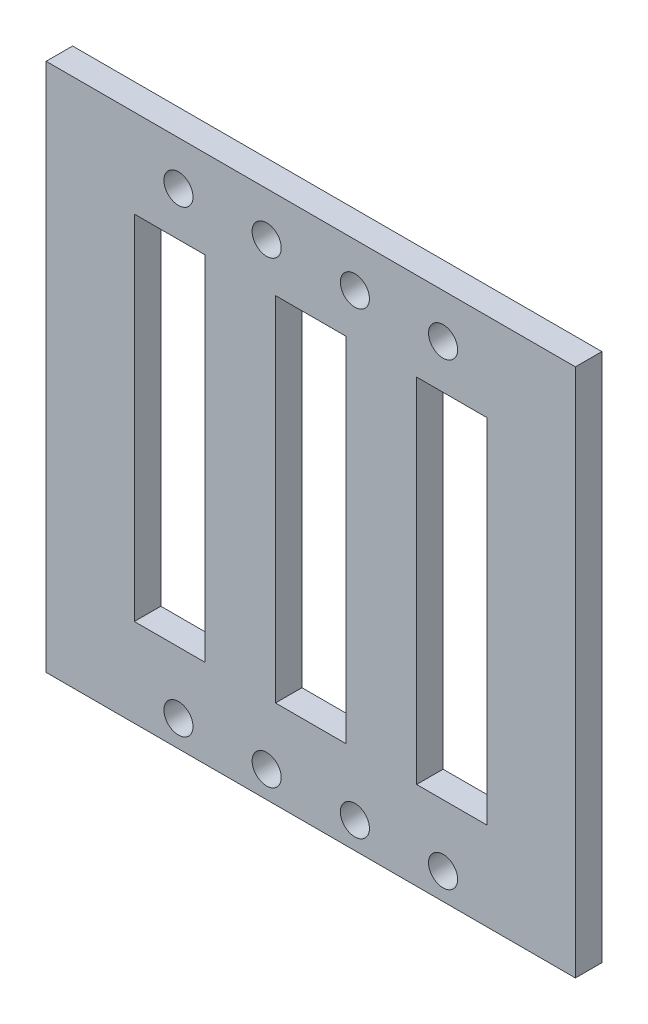
ISO-10303-21;
HEADER;
FILE_DESCRIPTION(('STEP AP214'),'2;1');
FILE_NAME('part.step','',(''),(''),'','','');
FILE_SCHEMA(('AUTOMOTIVE_DESIGN { 1 0 10303 214 1 1 1 1 }'));
ENDSEC;
DATA;
#1=APPLICATION_CONTEXT('core data for automotive mechanical design processes');
#2=APPLICATION_PROTOCOL_DEFINITION('international standard','automotive_design',2000,#1);
#3=PRODUCT_CONTEXT('',#1,'mechanical');
#4=PRODUCT('Part','Part','',(#3));
#5=PRODUCT_RELATED_PRODUCT_CATEGORY('part','',(#4));
#6=PRODUCT_DEFINITION_FORMATION('','',#4);
#7=PRODUCT_DEFINITION_CONTEXT('part definition',#1,'design');
#8=PRODUCT_DEFINITION('design','',#6,#7);
#9=PRODUCT_DEFINITION_SHAPE('','',#8);
#10=(LENGTH_UNIT() NAMED_UNIT(*) SI_UNIT(.MILLI.,.METRE.));
#11=(NAMED_UNIT(*) PLANE_ANGLE_UNIT() SI_UNIT($,.RADIAN.));
#12=(NAMED_UNIT(*) SI_UNIT($,.STERADIAN.) SOLID_ANGLE_UNIT());
#13=UNCERTAINTY_MEASURE_WITH_UNIT(LENGTH_MEASURE(1.E-05),#10,'distance_accuracy_value','');
#14=(GEOMETRIC_REPRESENTATION_CONTEXT(3) GLOBAL_UNCERTAINTY_ASSIGNED_CONTEXT((#13)) GLOBAL_UNIT_ASSIGNED_CONTEXT((#10,
#11,#12)) REPRESENTATION_CONTEXT('',''));
#15=CARTESIAN_POINT('',(0.,0.,0.));
#16=DIRECTION('',(0.,0.,1.));
#17=DIRECTION('',(1.,0.,0.));
#18=AXIS2_PLACEMENT_3D('',#15,#16,#17);
#19=CARTESIAN_POINT('',(30.,-30.,-3.));
#20=DIRECTION('',(1.,0.,0.));
#21=DIRECTION('',(0.,0.,-1.));
#22=AXIS2_PLACEMENT_3D('',#19,#20,#21);
#23=PLANE('',#22);
#24=DIRECTION('',(0.,1.,0.));
#25=VECTOR('',#24,1.);
#26=CARTESIAN_POINT('',(30.,-30.,0.));
#27=LINE('',#26,#25);
#28=CARTESIAN_POINT('',(30.,-30.,0.));
#29=VERTEX_POINT('',#28);
#30=CARTESIAN_POINT('',(30.,30.,0.));
#31=VERTEX_POINT('',#30);
#32=EDGE_CURVE('E292',#29,#31,#27,.T.);
#33=ORIENTED_EDGE('',*,*,#32,.F.);
#34=DIRECTION('',(0.,0.,1.));
#35=VECTOR('',#34,1.);
#36=CARTESIAN_POINT('',(30.,-30.,-3.));
#37=LINE('',#36,#35);
#38=CARTESIAN_POINT('',(30.,-30.,-3.));
#39=VERTEX_POINT('',#38);
#40=EDGE_CURVE('E11',#39,#29,#37,.T.);
#41=ORIENTED_EDGE('',*,*,#40,.F.);
#42=DIRECTION('',(0.,1.,0.));
#43=VECTOR('',#42,1.);
#44=CARTESIAN_POINT('',(30.,-30.,-3.));
#45=LINE('',#44,#43);
#46=CARTESIAN_POINT('',(30.,30.,-3.));
#47=VERTEX_POINT('',#46);
#48=EDGE_CURVE('E295',#39,#47,#45,.T.);
#49=ORIENTED_EDGE('',*,*,#48,.T.);
#50=DIRECTION('',(0.,0.,1.));
#51=VECTOR('',#50,1.);
#52=CARTESIAN_POINT('',(30.,30.,-3.));
#53=LINE('',#52,#51);
#54=EDGE_CURVE('E36',#47,#31,#53,.T.);
#55=ORIENTED_EDGE('',*,*,#54,.T.);
#56=EDGE_LOOP('',(#33,#41,#49,#55));
#57=FACE_BOUND('',#56,.T.);
#58=ADVANCED_FACE('F33',(#57),#23,.T.);
#59=CARTESIAN_POINT('',(-30.,-30.,-3.));
#60=DIRECTION('',(0.,-1.,0.));
#61=DIRECTION('',(0.,0.,-1.));
#62=AXIS2_PLACEMENT_3D('',#59,#60,#61);
#63=PLANE('',#62);
#64=DIRECTION('',(1.,0.,0.));
#65=VECTOR('',#64,1.);
#66=CARTESIAN_POINT('',(-30.,-30.,0.));
#67=LINE('',#66,#65);
#68=CARTESIAN_POINT('',(-30.,-30.,0.));
#69=VERTEX_POINT('',#68);
#70=EDGE_CURVE('E299',#69,#29,#67,.T.);
#71=ORIENTED_EDGE('',*,*,#70,.F.);
#72=DIRECTION('',(0.,0.,1.));
#73=VECTOR('',#72,1.);
#74=CARTESIAN_POINT('',(-30.,-30.,-3.));
#75=LINE('',#74,#73);
#76=CARTESIAN_POINT('',(-30.,-30.,-3.));
#77=VERTEX_POINT('',#76);
#78=EDGE_CURVE('E41',#77,#69,#75,.T.);
#79=ORIENTED_EDGE('',*,*,#78,.F.);
#80=DIRECTION('',(1.,0.,0.));
#81=VECTOR('',#80,1.);
#82=CARTESIAN_POINT('',(-30.,-30.,-3.));
#83=LINE('',#82,#81);
#84=EDGE_CURVE('E305',#77,#39,#83,.T.);
#85=ORIENTED_EDGE('',*,*,#84,.T.);
#86=ORIENTED_EDGE('',*,*,#40,.T.);
#87=EDGE_LOOP('',(#71,#79,#85,#86));
#88=FACE_BOUND('',#87,.T.);
#89=ADVANCED_FACE('F331',(#88),#63,.T.);
#90=CARTESIAN_POINT('',(-30.,-30.,-3.));
#91=DIRECTION('',(-1.,0.,0.));
#92=DIRECTION('',(0.,0.,1.));
#93=AXIS2_PLACEMENT_3D('',#90,#91,#92);
#94=PLANE('',#93);
#95=DIRECTION('',(0.,-1.,0.));
#96=VECTOR('',#95,1.);
#97=CARTESIAN_POINT('',(-30.,-30.,0.));
#98=LINE('',#97,#96);
#99=CARTESIAN_POINT('',(-30.,30.,0.));
#100=VERTEX_POINT('',#99);
#101=EDGE_CURVE('E313',#100,#69,#98,.T.);
#102=ORIENTED_EDGE('',*,*,#101,.F.);
#103=DIRECTION('',(0.,0.,1.));
#104=VECTOR('',#103,1.);
#105=CARTESIAN_POINT('',(-30.,30.,-3.));
#106=LINE('',#105,#104);
#107=CARTESIAN_POINT('',(-30.,30.,-3.));
#108=VERTEX_POINT('',#107);
#109=EDGE_CURVE('E318',#108,#100,#106,.T.);
#110=ORIENTED_EDGE('',*,*,#109,.F.);
#111=DIRECTION('',(0.,-1.,0.));
#112=VECTOR('',#111,1.);
#113=CARTESIAN_POINT('',(-30.,-30.,-3.));
#114=LINE('',#113,#112);
#115=EDGE_CURVE('E302',#108,#77,#114,.T.);
#116=ORIENTED_EDGE('',*,*,#115,.T.);
#117=ORIENTED_EDGE('',*,*,#78,.T.);
#118=EDGE_LOOP('',(#102,#110,#116,#117));
#119=FACE_BOUND('',#118,.T.);
#120=ADVANCED_FACE('F336',(#119),#94,.T.);
#121=CARTESIAN_POINT('',(-30.,30.,-3.));
#122=DIRECTION('',(0.,1.,0.));
#123=DIRECTION('',(0.,0.,1.));
#124=AXIS2_PLACEMENT_3D('',#121,#122,#123);
#125=PLANE('',#124);
#126=DIRECTION('',(-1.,0.,0.));
#127=VECTOR('',#126,1.);
#128=CARTESIAN_POINT('',(-30.,30.,0.));
#129=LINE('',#128,#127);
#130=EDGE_CURVE('E310',#31,#100,#129,.T.);
#131=ORIENTED_EDGE('',*,*,#130,.F.);
#132=ORIENTED_EDGE('',*,*,#54,.F.);
#133=DIRECTION('',(-1.,0.,0.));
#134=VECTOR('',#133,1.);
#135=CARTESIAN_POINT('',(-30.,30.,-3.));
#136=LINE('',#135,#134);
#137=EDGE_CURVE('E298',#47,#108,#136,.T.);
#138=ORIENTED_EDGE('',*,*,#137,.T.);
#139=ORIENTED_EDGE('',*,*,#109,.T.);
#140=EDGE_LOOP('',(#131,#132,#138,#139));
#141=FACE_BOUND('',#140,.T.);
#142=ADVANCED_FACE('F326',(#141),#125,.T.);
#143=CARTESIAN_POINT('',(0.,0.,-3.));
#144=DIRECTION('',(0.,0.,-1.));
#145=DIRECTION('',(-1.,0.,0.));
#146=AXIS2_PLACEMENT_3D('',#143,#144,#145);
#147=PLANE('',#146);
#148=DIRECTION('',(0.,1.,0.));
#149=VECTOR('',#148,1.);
#150=CARTESIAN_POINT('',(20.,-20.,-3.));
#151=LINE('',#150,#149);
#152=CARTESIAN_POINT('',(20.,-20.,-3.));
#153=VERTEX_POINT('',#152);
#154=CARTESIAN_POINT('',(20.,20.,-3.));
#155=VERTEX_POINT('',#154);
#156=EDGE_CURVE('E148',#153,#155,#151,.T.);
#157=ORIENTED_EDGE('',*,*,#156,.T.);
#158=DIRECTION('',(-1.,0.,0.));
#159=VECTOR('',#158,1.);
#160=CARTESIAN_POINT('',(12.,20.,-3.));
#161=LINE('',#160,#159);
#162=CARTESIAN_POINT('',(12.,20.,-3.));
#163=VERTEX_POINT('',#162);
#164=EDGE_CURVE('E157',#155,#163,#161,.T.);
#165=ORIENTED_EDGE('',*,*,#164,.T.);
#166=DIRECTION('',(0.,-1.,0.));
#167=VECTOR('',#166,1.);
#168=CARTESIAN_POINT('',(12.,-20.,-3.));
#169=LINE('',#168,#167);
#170=CARTESIAN_POINT('',(12.,-20.,-3.));
#171=VERTEX_POINT('',#170);
#172=EDGE_CURVE('E49',#163,#171,#169,.T.);
#173=ORIENTED_EDGE('',*,*,#172,.T.);
#174=DIRECTION('',(1.,0.,0.));
#175=VECTOR('',#174,1.);
#176=CARTESIAN_POINT('',(12.,-20.,-3.));
#177=LINE('',#176,#175);
#178=EDGE_CURVE('E154',#171,#153,#177,.T.);
#179=ORIENTED_EDGE('',*,*,#178,.T.);
#180=EDGE_LOOP('',(#157,#165,#173,#179));
#181=FACE_BOUND('',#180,.T.);
#182=DIRECTION('',(0.,1.,0.));
#183=VECTOR('',#182,1.);
#184=CARTESIAN_POINT('',(4.,-20.,-3.));
#185=LINE('',#184,#183);
#186=CARTESIAN_POINT('',(4.,-20.,-3.));
#187=VERTEX_POINT('',#186);
#188=CARTESIAN_POINT('',(4.,20.,-3.));
#189=VERTEX_POINT('',#188);
#190=EDGE_CURVE('E183',#187,#189,#185,.T.);
#191=ORIENTED_EDGE('',*,*,#190,.T.);
#192=DIRECTION('',(-1.,0.,0.));
#193=VECTOR('',#192,1.);
#194=CARTESIAN_POINT('',(-4.,20.,-3.));
#195=LINE('',#194,#193);
#196=CARTESIAN_POINT('',(-4.,20.,-3.));
#197=VERTEX_POINT('',#196);
#198=EDGE_CURVE('E186',#189,#197,#195,.T.);
#199=ORIENTED_EDGE('',*,*,#198,.T.);
#200=DIRECTION('',(0.,-1.,0.));
#201=VECTOR('',#200,1.);
#202=CARTESIAN_POINT('',(-4.,-20.,-3.));
#203=LINE('',#202,#201);
#204=CARTESIAN_POINT('',(-4.,-20.,-3.));
#205=VERTEX_POINT('',#204);
#206=EDGE_CURVE('E190',#197,#205,#203,.T.);
#207=ORIENTED_EDGE('',*,*,#206,.T.);
#208=DIRECTION('',(1.,0.,0.));
#209=VECTOR('',#208,1.);
#210=CARTESIAN_POINT('',(-4.,-20.,-3.));
#211=LINE('',#210,#209);
#212=EDGE_CURVE('E193',#205,#187,#211,.T.);
#213=ORIENTED_EDGE('',*,*,#212,.T.);
#214=EDGE_LOOP('',(#191,#199,#207,#213));
#215=FACE_BOUND('',#214,.T.);
#216=DIRECTION('',(0.,1.,0.));
#217=VECTOR('',#216,1.);
#218=CARTESIAN_POINT('',(-12.,20.,-3.));
#219=LINE('',#218,#217);
#220=CARTESIAN_POINT('',(-12.,-20.,-3.));
#221=VERTEX_POINT('',#220);
#222=CARTESIAN_POINT('',(-12.,20.,-3.));
#223=VERTEX_POINT('',#222);
#224=EDGE_CURVE('E215',#221,#223,#219,.T.);
#225=ORIENTED_EDGE('',*,*,#224,.T.);
#226=DIRECTION('',(-1.,0.,0.));
#227=VECTOR('',#226,1.);
#228=CARTESIAN_POINT('',(-20.,20.,-3.));
#229=LINE('',#228,#227);
#230=CARTESIAN_POINT('',(-20.,20.,-3.));
#231=VERTEX_POINT('',#230);
#232=EDGE_CURVE('E218',#223,#231,#229,.T.);
#233=ORIENTED_EDGE('',*,*,#232,.T.);
#234=DIRECTION('',(0.,-1.,0.));
#235=VECTOR('',#234,1.);
#236=CARTESIAN_POINT('',(-20.,20.,-3.));
#237=LINE('',#236,#235);
#238=CARTESIAN_POINT('',(-20.,-20.,-3.));
#239=VERTEX_POINT('',#238);
#240=EDGE_CURVE('E222',#231,#239,#237,.T.);
#241=ORIENTED_EDGE('',*,*,#240,.T.);
#242=DIRECTION('',(1.,0.,0.));
#243=VECTOR('',#242,1.);
#244=CARTESIAN_POINT('',(-20.,-20.,-3.));
#245=LINE('',#244,#243);
#246=EDGE_CURVE('E225',#239,#221,#245,.T.);
#247=ORIENTED_EDGE('',*,*,#246,.T.);
#248=EDGE_LOOP('',(#225,#233,#241,#247));
#249=FACE_BOUND('',#248,.T.);
#250=CARTESIAN_POINT('',(15.,-27.,-3.));
#251=DIRECTION('',(0.,0.,1.));
#252=DIRECTION('',(1.,0.,0.));
#253=AXIS2_PLACEMENT_3D('',#250,#251,#252);
#254=CIRCLE('',#253,1.65);
#255=CARTESIAN_POINT('',(16.65,-27.,-3.));
#256=VERTEX_POINT('',#255);
#257=EDGE_CURVE('E247',#256,#256,#254,.T.);
#258=ORIENTED_EDGE('',*,*,#257,.T.);
#259=EDGE_LOOP('',(#258));
#260=FACE_BOUND('',#259,.T.);
#261=CARTESIAN_POINT('',(5.,-27.,-3.));
#262=DIRECTION('',(0.,0.,1.));
#263=DIRECTION('',(1.,0.,0.));
#264=AXIS2_PLACEMENT_3D('',#261,#262,#263);
#265=CIRCLE('',#264,1.65);
#266=CARTESIAN_POINT('',(6.65,-27.,-3.));
#267=VERTEX_POINT('',#266);
#268=EDGE_CURVE('E253',#267,#267,#265,.T.);
#269=ORIENTED_EDGE('',*,*,#268,.T.);
#270=EDGE_LOOP('',(#269));
#271=FACE_BOUND('',#270,.T.);
#272=CARTESIAN_POINT('',(-5.,-27.,-3.));
#273=DIRECTION('',(0.,0.,1.));
#274=DIRECTION('',(1.,0.,0.));
#275=AXIS2_PLACEMENT_3D('',#272,#273,#274);
#276=CIRCLE('',#275,1.65);
#277=CARTESIAN_POINT('',(-3.35,-27.,-3.));
#278=VERTEX_POINT('',#277);
#279=EDGE_CURVE('E259',#278,#278,#276,.T.);
#280=ORIENTED_EDGE('',*,*,#279,.T.);
#281=EDGE_LOOP('',(#280));
#282=FACE_BOUND('',#281,.T.);
#283=CARTESIAN_POINT('',(-15.,-27.,-3.));
#284=DIRECTION('',(0.,0.,1.));
#285=DIRECTION('',(1.,0.,0.));
#286=AXIS2_PLACEMENT_3D('',#283,#284,#285);
#287=CIRCLE('',#286,1.65);
#288=CARTESIAN_POINT('',(-13.35,-27.,-3.));
#289=VERTEX_POINT('',#288);
#290=EDGE_CURVE('E265',#289,#289,#287,.T.);
#291=ORIENTED_EDGE('',*,*,#290,.T.);
#292=EDGE_LOOP('',(#291));
#293=FACE_BOUND('',#292,.T.);
#294=CARTESIAN_POINT('',(-5.,25.,-3.));
#295=DIRECTION('',(0.,0.,1.));
#296=DIRECTION('',(1.,0.,0.));
#297=AXIS2_PLACEMENT_3D('',#294,#295,#296);
#298=CIRCLE('',#297,1.65);
#299=CARTESIAN_POINT('',(-3.35,25.,-3.));
#300=VERTEX_POINT('',#299);
#301=EDGE_CURVE('E271',#300,#300,#298,.T.);
#302=ORIENTED_EDGE('',*,*,#301,.T.);
#303=EDGE_LOOP('',(#302));
#304=FACE_BOUND('',#303,.T.);
#305=CARTESIAN_POINT('',(15.,25.,-3.));
#306=DIRECTION('',(0.,0.,1.));
#307=DIRECTION('',(1.,0.,0.));
#308=AXIS2_PLACEMENT_3D('',#305,#306,#307);
#309=CIRCLE('',#308,1.65);
#310=CARTESIAN_POINT('',(16.65,25.,-3.));
#311=VERTEX_POINT('',#310);
#312=EDGE_CURVE('E277',#311,#311,#309,.T.);
#313=ORIENTED_EDGE('',*,*,#312,.T.);
#314=EDGE_LOOP('',(#313));
#315=FACE_BOUND('',#314,.T.);
#316=CARTESIAN_POINT('',(5.,25.,-3.));
#317=DIRECTION('',(0.,0.,1.));
#318=DIRECTION('',(1.,0.,0.));
#319=AXIS2_PLACEMENT_3D('',#316,#317,#318);
#320=CIRCLE('',#319,1.65);
#321=CARTESIAN_POINT('',(6.65,25.,-3.));
#322=VERTEX_POINT('',#321);
#323=EDGE_CURVE('E283',#322,#322,#320,.T.);
#324=ORIENTED_EDGE('',*,*,#323,.T.);
#325=EDGE_LOOP('',(#324));
#326=FACE_BOUND('',#325,.T.);
#327=CARTESIAN_POINT('',(-15.,25.,-3.));
#328=DIRECTION('',(0.,0.,1.));
#329=DIRECTION('',(1.,0.,0.));
#330=AXIS2_PLACEMENT_3D('',#327,#328,#329);
#331=CIRCLE('',#330,1.65);
#332=CARTESIAN_POINT('',(-13.35,25.,-3.));
#333=VERTEX_POINT('',#332);
#334=EDGE_CURVE('E289',#333,#333,#331,.T.);
#335=ORIENTED_EDGE('',*,*,#334,.T.);
#336=EDGE_LOOP('',(#335));
#337=FACE_BOUND('',#336,.T.);
#338=ORIENTED_EDGE('',*,*,#48,.F.);
#339=ORIENTED_EDGE('',*,*,#84,.F.);
#340=ORIENTED_EDGE('',*,*,#115,.F.);
#341=ORIENTED_EDGE('',*,*,#137,.F.);
#342=EDGE_LOOP('',(#338,#339,#340,#341));
#343=FACE_BOUND('',#342,.T.);
#344=ADVANCED_FACE('F161',(#181,#215,#249,#260,#271,#282,#293,#304,#315,#326,#337,#343),#147,.T.);
#345=CARTESIAN_POINT('',(0.,0.,0.));
#346=DIRECTION('',(0.,0.,-1.));
#347=DIRECTION('',(-1.,0.,0.));
#348=AXIS2_PLACEMENT_3D('',#345,#346,#347);
#349=PLANE('',#348);
#350=DIRECTION('',(-1.,0.,0.));
#351=VECTOR('',#350,1.);
#352=CARTESIAN_POINT('',(12.,20.,0.));
#353=LINE('',#352,#351);
#354=CARTESIAN_POINT('',(20.,20.,0.));
#355=VERTEX_POINT('',#354);
#356=CARTESIAN_POINT('',(12.,20.,0.));
#357=VERTEX_POINT('',#356);
#358=EDGE_CURVE('E173',#355,#357,#353,.T.);
#359=ORIENTED_EDGE('',*,*,#358,.F.);
#360=DIRECTION('',(0.,1.,0.));
#361=VECTOR('',#360,1.);
#362=CARTESIAN_POINT('',(20.,-20.,0.));
#363=LINE('',#362,#361);
#364=CARTESIAN_POINT('',(20.,-20.,0.));
#365=VERTEX_POINT('',#364);
#366=EDGE_CURVE('E57',#365,#355,#363,.T.);
#367=ORIENTED_EDGE('',*,*,#366,.F.);
#368=DIRECTION('',(1.,0.,0.));
#369=VECTOR('',#368,1.);
#370=CARTESIAN_POINT('',(12.,-20.,0.));
#371=LINE('',#370,#369);
#372=CARTESIAN_POINT('',(12.,-20.,0.));
#373=VERTEX_POINT('',#372);
#374=EDGE_CURVE('E164',#373,#365,#371,.T.);
#375=ORIENTED_EDGE('',*,*,#374,.F.);
#376=DIRECTION('',(0.,-1.,0.));
#377=VECTOR('',#376,1.);
#378=CARTESIAN_POINT('',(12.,-20.,0.));
#379=LINE('',#378,#377);
#380=EDGE_CURVE('E167',#357,#373,#379,.T.);
#381=ORIENTED_EDGE('',*,*,#380,.F.);
#382=EDGE_LOOP('',(#359,#367,#375,#381));
#383=FACE_BOUND('',#382,.T.);
#384=DIRECTION('',(-1.,0.,0.));
#385=VECTOR('',#384,1.);
#386=CARTESIAN_POINT('',(-4.,20.,0.));
#387=LINE('',#386,#385);
#388=CARTESIAN_POINT('',(4.,20.,0.));
#389=VERTEX_POINT('',#388);
#390=CARTESIAN_POINT('',(-4.,20.,0.));
#391=VERTEX_POINT('',#390);
#392=EDGE_CURVE('E198',#389,#391,#387,.T.);
#393=ORIENTED_EDGE('',*,*,#392,.F.);
#394=DIRECTION('',(0.,1.,0.));
#395=VECTOR('',#394,1.);
#396=CARTESIAN_POINT('',(4.,-20.,0.));
#397=LINE('',#396,#395);
#398=CARTESIAN_POINT('',(4.,-20.,0.));
#399=VERTEX_POINT('',#398);
#400=EDGE_CURVE('E179',#399,#389,#397,.T.);
#401=ORIENTED_EDGE('',*,*,#400,.F.);
#402=DIRECTION('',(1.,0.,0.));
#403=VECTOR('',#402,1.);
#404=CARTESIAN_POINT('',(-4.,-20.,0.));
#405=LINE('',#404,#403);
#406=CARTESIAN_POINT('',(-4.,-20.,0.));
#407=VERTEX_POINT('',#406);
#408=EDGE_CURVE('E187',#407,#399,#405,.T.);
#409=ORIENTED_EDGE('',*,*,#408,.F.);
#410=DIRECTION('',(0.,-1.,0.));
#411=VECTOR('',#410,1.);
#412=CARTESIAN_POINT('',(-4.,-20.,0.));
#413=LINE('',#412,#411);
#414=EDGE_CURVE('E201',#391,#407,#413,.T.);
#415=ORIENTED_EDGE('',*,*,#414,.F.);
#416=EDGE_LOOP('',(#393,#401,#409,#415));
#417=FACE_BOUND('',#416,.T.);
#418=DIRECTION('',(-1.,0.,0.));
#419=VECTOR('',#418,1.);
#420=CARTESIAN_POINT('',(-20.,20.,0.));
#421=LINE('',#420,#419);
#422=CARTESIAN_POINT('',(-12.,20.,0.));
#423=VERTEX_POINT('',#422);
#424=CARTESIAN_POINT('',(-20.,20.,0.));
#425=VERTEX_POINT('',#424);
#426=EDGE_CURVE('E230',#423,#425,#421,.T.);
#427=ORIENTED_EDGE('',*,*,#426,.F.);
#428=DIRECTION('',(0.,1.,0.));
#429=VECTOR('',#428,1.);
#430=CARTESIAN_POINT('',(-12.,20.,0.));
#431=LINE('',#430,#429);
#432=CARTESIAN_POINT('',(-12.,-20.,0.));
#433=VERTEX_POINT('',#432);
#434=EDGE_CURVE('E208',#433,#423,#431,.T.);
#435=ORIENTED_EDGE('',*,*,#434,.F.);
#436=DIRECTION('',(1.,0.,0.));
#437=VECTOR('',#436,1.);
#438=CARTESIAN_POINT('',(-20.,-20.,0.));
#439=LINE('',#438,#437);
#440=CARTESIAN_POINT('',(-20.,-20.,0.));
#441=VERTEX_POINT('',#440);
#442=EDGE_CURVE('E219',#441,#433,#439,.T.);
#443=ORIENTED_EDGE('',*,*,#442,.F.);
#444=DIRECTION('',(0.,-1.,0.));
#445=VECTOR('',#444,1.);
#446=CARTESIAN_POINT('',(-20.,20.,0.));
#447=LINE('',#446,#445);
#448=EDGE_CURVE('E233',#425,#441,#447,.T.);
#449=ORIENTED_EDGE('',*,*,#448,.F.);
#450=EDGE_LOOP('',(#427,#435,#443,#449));
#451=FACE_BOUND('',#450,.T.);
#452=CARTESIAN_POINT('',(15.,-27.,0.));
#453=DIRECTION('',(0.,0.,1.));
#454=DIRECTION('',(1.,0.,0.));
#455=AXIS2_PLACEMENT_3D('',#452,#453,#454);
#456=CIRCLE('',#455,1.65);
#457=CARTESIAN_POINT('',(16.65,-27.,0.));
#458=VERTEX_POINT('',#457);
#459=EDGE_CURVE('E240',#458,#458,#456,.T.);
#460=ORIENTED_EDGE('',*,*,#459,.F.);
#461=EDGE_LOOP('',(#460));
#462=FACE_BOUND('',#461,.T.);
#463=CARTESIAN_POINT('',(5.,-27.,0.));
#464=DIRECTION('',(0.,0.,1.));
#465=DIRECTION('',(1.,0.,0.));
#466=AXIS2_PLACEMENT_3D('',#463,#464,#465);
#467=CIRCLE('',#466,1.65);
#468=CARTESIAN_POINT('',(6.65,-27.,0.));
#469=VERTEX_POINT('',#468);
#470=EDGE_CURVE('E250',#469,#469,#467,.T.);
#471=ORIENTED_EDGE('',*,*,#470,.F.);
#472=EDGE_LOOP('',(#471));
#473=FACE_BOUND('',#472,.T.);
#474=CARTESIAN_POINT('',(-5.,-27.,0.));
#475=DIRECTION('',(0.,0.,1.));
#476=DIRECTION('',(1.,0.,0.));
#477=AXIS2_PLACEMENT_3D('',#474,#475,#476);
#478=CIRCLE('',#477,1.65);
#479=CARTESIAN_POINT('',(-3.35,-27.,0.));
#480=VERTEX_POINT('',#479);
#481=EDGE_CURVE('E256',#480,#480,#478,.T.);
#482=ORIENTED_EDGE('',*,*,#481,.F.);
#483=EDGE_LOOP('',(#482));
#484=FACE_BOUND('',#483,.T.);
#485=CARTESIAN_POINT('',(-15.,-27.,0.));
#486=DIRECTION('',(0.,0.,1.));
#487=DIRECTION('',(1.,0.,0.));
#488=AXIS2_PLACEMENT_3D('',#485,#486,#487);
#489=CIRCLE('',#488,1.65);
#490=CARTESIAN_POINT('',(-13.35,-27.,0.));
#491=VERTEX_POINT('',#490);
#492=EDGE_CURVE('E262',#491,#491,#489,.T.);
#493=ORIENTED_EDGE('',*,*,#492,.F.);
#494=EDGE_LOOP('',(#493));
#495=FACE_BOUND('',#494,.T.);
#496=CARTESIAN_POINT('',(-5.,25.,0.));
#497=DIRECTION('',(0.,0.,1.));
#498=DIRECTION('',(1.,0.,0.));
#499=AXIS2_PLACEMENT_3D('',#496,#497,#498);
#500=CIRCLE('',#499,1.65);
#501=CARTESIAN_POINT('',(-3.35,25.,0.));
#502=VERTEX_POINT('',#501);
#503=EDGE_CURVE('E268',#502,#502,#500,.T.);
#504=ORIENTED_EDGE('',*,*,#503,.F.);
#505=EDGE_LOOP('',(#504));
#506=FACE_BOUND('',#505,.T.);
#507=CARTESIAN_POINT('',(15.,25.,0.));
#508=DIRECTION('',(0.,0.,1.));
#509=DIRECTION('',(1.,0.,0.));
#510=AXIS2_PLACEMENT_3D('',#507,#508,#509);
#511=CIRCLE('',#510,1.65);
#512=CARTESIAN_POINT('',(16.65,25.,0.));
#513=VERTEX_POINT('',#512);
#514=EDGE_CURVE('E274',#513,#513,#511,.T.);
#515=ORIENTED_EDGE('',*,*,#514,.F.);
#516=EDGE_LOOP('',(#515));
#517=FACE_BOUND('',#516,.T.);
#518=CARTESIAN_POINT('',(5.,25.,0.));
#519=DIRECTION('',(0.,0.,1.));
#520=DIRECTION('',(1.,0.,0.));
#521=AXIS2_PLACEMENT_3D('',#518,#519,#520);
#522=CIRCLE('',#521,1.65);
#523=CARTESIAN_POINT('',(6.65,25.,0.));
#524=VERTEX_POINT('',#523);
#525=EDGE_CURVE('E280',#524,#524,#522,.T.);
#526=ORIENTED_EDGE('',*,*,#525,.F.);
#527=EDGE_LOOP('',(#526));
#528=FACE_BOUND('',#527,.T.);
#529=CARTESIAN_POINT('',(-15.,25.,0.));
#530=DIRECTION('',(0.,0.,1.));
#531=DIRECTION('',(1.,0.,0.));
#532=AXIS2_PLACEMENT_3D('',#529,#530,#531);
#533=CIRCLE('',#532,1.65);
#534=CARTESIAN_POINT('',(-13.35,25.,0.));
#535=VERTEX_POINT('',#534);
#536=EDGE_CURVE('E286',#535,#535,#533,.T.);
#537=ORIENTED_EDGE('',*,*,#536,.F.);
#538=EDGE_LOOP('',(#537));
#539=FACE_BOUND('',#538,.T.);
#540=ORIENTED_EDGE('',*,*,#32,.T.);
#541=ORIENTED_EDGE('',*,*,#130,.T.);
#542=ORIENTED_EDGE('',*,*,#101,.T.);
#543=ORIENTED_EDGE('',*,*,#70,.T.);
#544=EDGE_LOOP('',(#540,#541,#542,#543));
#545=FACE_BOUND('',#544,.T.);
#546=ADVANCED_FACE('F328',(#383,#417,#451,#462,#473,#484,#495,#506,#517,#528,#539,#545),#349,.F.);
#547=CARTESIAN_POINT('',(-15.,25.,-3.));
#548=DIRECTION('',(0.,0.,1.));
#549=DIRECTION('',(1.,0.,0.));
#550=AXIS2_PLACEMENT_3D('',#547,#548,#549);
#551=CYLINDRICAL_SURFACE('',#550,1.65);
#552=ORIENTED_EDGE('',*,*,#334,.F.);
#553=EDGE_LOOP('',(#552));
#554=FACE_BOUND('',#553,.T.);
#555=ORIENTED_EDGE('',*,*,#536,.T.);
#556=EDGE_LOOP('',(#555));
#557=FACE_BOUND('',#556,.T.);
#558=ADVANCED_FACE('F368',(#554,#557),#551,.F.);
#559=CARTESIAN_POINT('',(5.,25.,-3.));
#560=DIRECTION('',(0.,0.,1.));
#561=DIRECTION('',(1.,0.,0.));
#562=AXIS2_PLACEMENT_3D('',#559,#560,#561);
#563=CYLINDRICAL_SURFACE('',#562,1.65);
#564=ORIENTED_EDGE('',*,*,#323,.F.);
#565=EDGE_LOOP('',(#564));
#566=FACE_BOUND('',#565,.T.);
#567=ORIENTED_EDGE('',*,*,#525,.T.);
#568=EDGE_LOOP('',(#567));
#569=FACE_BOUND('',#568,.T.);
#570=ADVANCED_FACE('F373',(#566,#569),#563,.F.);
#571=CARTESIAN_POINT('',(15.,25.,-3.));
#572=DIRECTION('',(0.,0.,1.));
#573=DIRECTION('',(1.,0.,0.));
#574=AXIS2_PLACEMENT_3D('',#571,#572,#573);
#575=CYLINDRICAL_SURFACE('',#574,1.65);
#576=ORIENTED_EDGE('',*,*,#312,.F.);
#577=EDGE_LOOP('',(#576));
#578=FACE_BOUND('',#577,.T.);
#579=ORIENTED_EDGE('',*,*,#514,.T.);
#580=EDGE_LOOP('',(#579));
#581=FACE_BOUND('',#580,.T.);
#582=ADVANCED_FACE('F385',(#578,#581),#575,.F.);
#583=CARTESIAN_POINT('',(-5.,25.,-3.));
#584=DIRECTION('',(0.,0.,1.));
#585=DIRECTION('',(1.,0.,0.));
#586=AXIS2_PLACEMENT_3D('',#583,#584,#585);
#587=CYLINDRICAL_SURFACE('',#586,1.65);
#588=ORIENTED_EDGE('',*,*,#301,.F.);
#589=EDGE_LOOP('',(#588));
#590=FACE_BOUND('',#589,.T.);
#591=ORIENTED_EDGE('',*,*,#503,.T.);
#592=EDGE_LOOP('',(#591));
#593=FACE_BOUND('',#592,.T.);
#594=ADVANCED_FACE('F395',(#590,#593),#587,.F.);
#595=CARTESIAN_POINT('',(-15.,-27.,-3.));
#596=DIRECTION('',(0.,0.,1.));
#597=DIRECTION('',(1.,0.,0.));
#598=AXIS2_PLACEMENT_3D('',#595,#596,#597);
#599=CYLINDRICAL_SURFACE('',#598,1.65);
#600=ORIENTED_EDGE('',*,*,#290,.F.);
#601=EDGE_LOOP('',(#600));
#602=FACE_BOUND('',#601,.T.);
#603=ORIENTED_EDGE('',*,*,#492,.T.);
#604=EDGE_LOOP('',(#603));
#605=FACE_BOUND('',#604,.T.);
#606=ADVANCED_FACE('F405',(#602,#605),#599,.F.);
#607=CARTESIAN_POINT('',(-5.,-27.,-3.));
#608=DIRECTION('',(0.,0.,1.));
#609=DIRECTION('',(1.,0.,0.));
#610=AXIS2_PLACEMENT_3D('',#607,#608,#609);
#611=CYLINDRICAL_SURFACE('',#610,1.65);
#612=ORIENTED_EDGE('',*,*,#279,.F.);
#613=EDGE_LOOP('',(#612));
#614=FACE_BOUND('',#613,.T.);
#615=ORIENTED_EDGE('',*,*,#481,.T.);
#616=EDGE_LOOP('',(#615));
#617=FACE_BOUND('',#616,.T.);
#618=ADVANCED_FACE('F415',(#614,#617),#611,.F.);
#619=CARTESIAN_POINT('',(5.,-27.,-3.));
#620=DIRECTION('',(0.,0.,1.));
#621=DIRECTION('',(1.,0.,0.));
#622=AXIS2_PLACEMENT_3D('',#619,#620,#621);
#623=CYLINDRICAL_SURFACE('',#622,1.65);
#624=ORIENTED_EDGE('',*,*,#268,.F.);
#625=EDGE_LOOP('',(#624));
#626=FACE_BOUND('',#625,.T.);
#627=ORIENTED_EDGE('',*,*,#470,.T.);
#628=EDGE_LOOP('',(#627));
#629=FACE_BOUND('',#628,.T.);
#630=ADVANCED_FACE('F425',(#626,#629),#623,.F.);
#631=CARTESIAN_POINT('',(15.,-27.,-3.));
#632=DIRECTION('',(0.,0.,1.));
#633=DIRECTION('',(1.,0.,0.));
#634=AXIS2_PLACEMENT_3D('',#631,#632,#633);
#635=CYLINDRICAL_SURFACE('',#634,1.65);
#636=ORIENTED_EDGE('',*,*,#257,.F.);
#637=EDGE_LOOP('',(#636));
#638=FACE_BOUND('',#637,.T.);
#639=ORIENTED_EDGE('',*,*,#459,.T.);
#640=EDGE_LOOP('',(#639));
#641=FACE_BOUND('',#640,.T.);
#642=ADVANCED_FACE('F435',(#638,#641),#635,.F.);
#643=CARTESIAN_POINT('',(-12.,20.,-3.));
#644=DIRECTION('',(1.,0.,0.));
#645=DIRECTION('',(0.,1.,0.));
#646=AXIS2_PLACEMENT_3D('',#643,#644,#645);
#647=PLANE('',#646);
#648=ORIENTED_EDGE('',*,*,#434,.T.);
#649=DIRECTION('',(0.,0.,1.));
#650=VECTOR('',#649,1.);
#651=CARTESIAN_POINT('',(-12.,20.,-3.));
#652=LINE('',#651,#650);
#653=EDGE_CURVE('E228',#223,#423,#652,.T.);
#654=ORIENTED_EDGE('',*,*,#653,.F.);
#655=ORIENTED_EDGE('',*,*,#224,.F.);
#656=DIRECTION('',(0.,0.,1.));
#657=VECTOR('',#656,1.);
#658=CARTESIAN_POINT('',(-12.,-20.,-3.));
#659=LINE('',#658,#657);
#660=EDGE_CURVE('E238',#221,#433,#659,.T.);
#661=ORIENTED_EDGE('',*,*,#660,.T.);
#662=EDGE_LOOP('',(#648,#654,#655,#661));
#663=FACE_BOUND('',#662,.T.);
#664=ADVANCED_FACE('F445',(#663),#647,.F.);
#665=CARTESIAN_POINT('',(-20.,-20.,-3.));
#666=DIRECTION('',(0.,-1.,0.));
#667=DIRECTION('',(1.,0.,0.));
#668=AXIS2_PLACEMENT_3D('',#665,#666,#667);
#669=PLANE('',#668);
#670=ORIENTED_EDGE('',*,*,#442,.T.);
#671=ORIENTED_EDGE('',*,*,#660,.F.);
#672=ORIENTED_EDGE('',*,*,#246,.F.);
#673=DIRECTION('',(0.,0.,1.));
#674=VECTOR('',#673,1.);
#675=CARTESIAN_POINT('',(-20.,-20.,-3.));
#676=LINE('',#675,#674);
#677=EDGE_CURVE('E241',#239,#441,#676,.T.);
#678=ORIENTED_EDGE('',*,*,#677,.T.);
#679=EDGE_LOOP('',(#670,#671,#672,#678));
#680=FACE_BOUND('',#679,.T.);
#681=ADVANCED_FACE('F468',(#680),#669,.F.);
#682=CARTESIAN_POINT('',(-20.,20.,-3.));
#683=DIRECTION('',(-1.,0.,0.));
#684=DIRECTION('',(0.,-1.,0.));
#685=AXIS2_PLACEMENT_3D('',#682,#683,#684);
#686=PLANE('',#685);
#687=ORIENTED_EDGE('',*,*,#448,.T.);
#688=ORIENTED_EDGE('',*,*,#677,.F.);
#689=ORIENTED_EDGE('',*,*,#240,.F.);
#690=DIRECTION('',(0.,0.,1.));
#691=VECTOR('',#690,1.);
#692=CARTESIAN_POINT('',(-20.,20.,-3.));
#693=LINE('',#692,#691);
#694=EDGE_CURVE('E243',#231,#425,#693,.T.);
#695=ORIENTED_EDGE('',*,*,#694,.T.);
#696=EDGE_LOOP('',(#687,#688,#689,#695));
#697=FACE_BOUND('',#696,.T.);
#698=ADVANCED_FACE('F478',(#697),#686,.F.);
#699=CARTESIAN_POINT('',(-20.,20.,-3.));
#700=DIRECTION('',(0.,1.,0.));
#701=DIRECTION('',(0.,0.,1.));
#702=AXIS2_PLACEMENT_3D('',#699,#700,#701);
#703=PLANE('',#702);
#704=ORIENTED_EDGE('',*,*,#426,.T.);
#705=ORIENTED_EDGE('',*,*,#694,.F.);
#706=ORIENTED_EDGE('',*,*,#232,.F.);
#707=ORIENTED_EDGE('',*,*,#653,.T.);
#708=EDGE_LOOP('',(#704,#705,#706,#707));
#709=FACE_BOUND('',#708,.T.);
#710=ADVANCED_FACE('F488',(#709),#703,.F.);
#711=CARTESIAN_POINT('',(4.,-20.,-3.));
#712=DIRECTION('',(1.,0.,0.));
#713=DIRECTION('',(0.,0.,-1.));
#714=AXIS2_PLACEMENT_3D('',#711,#712,#713);
#715=PLANE('',#714);
#716=ORIENTED_EDGE('',*,*,#400,.T.);
#717=DIRECTION('',(0.,0.,1.));
#718=VECTOR('',#717,1.);
#719=CARTESIAN_POINT('',(4.,20.,-3.));
#720=LINE('',#719,#718);
#721=EDGE_CURVE('E196',#189,#389,#720,.T.);
#722=ORIENTED_EDGE('',*,*,#721,.F.);
#723=ORIENTED_EDGE('',*,*,#190,.F.);
#724=DIRECTION('',(0.,0.,1.));
#725=VECTOR('',#724,1.);
#726=CARTESIAN_POINT('',(4.,-20.,-3.));
#727=LINE('',#726,#725);
#728=EDGE_CURVE('E206',#187,#399,#727,.T.);
#729=ORIENTED_EDGE('',*,*,#728,.T.);
#730=EDGE_LOOP('',(#716,#722,#723,#729));
#731=FACE_BOUND('',#730,.T.);
#732=ADVANCED_FACE('F498',(#731),#715,.F.);
#733=CARTESIAN_POINT('',(-4.,-20.,-3.));
#734=DIRECTION('',(0.,-1.,0.));
#735=DIRECTION('',(1.,0.,0.));
#736=AXIS2_PLACEMENT_3D('',#733,#734,#735);
#737=PLANE('',#736);
#738=ORIENTED_EDGE('',*,*,#408,.T.);
#739=ORIENTED_EDGE('',*,*,#728,.F.);
#740=ORIENTED_EDGE('',*,*,#212,.F.);
#741=DIRECTION('',(0.,0.,1.));
#742=VECTOR('',#741,1.);
#743=CARTESIAN_POINT('',(-4.,-20.,-3.));
#744=LINE('',#743,#742);
#745=EDGE_CURVE('E209',#205,#407,#744,.T.);
#746=ORIENTED_EDGE('',*,*,#745,.T.);
#747=EDGE_LOOP('',(#738,#739,#740,#746));
#748=FACE_BOUND('',#747,.T.);
#749=ADVANCED_FACE('F508',(#748),#737,.F.);
#750=CARTESIAN_POINT('',(-4.,-20.,-3.));
#751=DIRECTION('',(-1.,0.,0.));
#752=DIRECTION('',(0.,0.,1.));
#753=AXIS2_PLACEMENT_3D('',#750,#751,#752);
#754=PLANE('',#753);
#755=ORIENTED_EDGE('',*,*,#414,.T.);
#756=ORIENTED_EDGE('',*,*,#745,.F.);
#757=ORIENTED_EDGE('',*,*,#206,.F.);
#758=DIRECTION('',(0.,0.,1.));
#759=VECTOR('',#758,1.);
#760=CARTESIAN_POINT('',(-4.,20.,-3.));
#761=LINE('',#760,#759);
#762=EDGE_CURVE('E211',#197,#391,#761,.T.);
#763=ORIENTED_EDGE('',*,*,#762,.T.);
#764=EDGE_LOOP('',(#755,#756,#757,#763));
#765=FACE_BOUND('',#764,.T.);
#766=ADVANCED_FACE('F518',(#765),#754,.F.);
#767=CARTESIAN_POINT('',(-4.,20.,-3.));
#768=DIRECTION('',(0.,1.,0.));
#769=DIRECTION('',(-1.,0.,0.));
#770=AXIS2_PLACEMENT_3D('',#767,#768,#769);
#771=PLANE('',#770);
#772=ORIENTED_EDGE('',*,*,#392,.T.);
#773=ORIENTED_EDGE('',*,*,#762,.F.);
#774=ORIENTED_EDGE('',*,*,#198,.F.);
#775=ORIENTED_EDGE('',*,*,#721,.T.);
#776=EDGE_LOOP('',(#772,#773,#774,#775));
#777=FACE_BOUND('',#776,.T.);
#778=ADVANCED_FACE('F528',(#777),#771,.F.);
#779=CARTESIAN_POINT('',(20.,-20.,-3.));
#780=DIRECTION('',(1.,0.,0.));
#781=DIRECTION('',(0.,0.,-1.));
#782=AXIS2_PLACEMENT_3D('',#779,#780,#781);
#783=PLANE('',#782);
#784=ORIENTED_EDGE('',*,*,#366,.T.);
#785=DIRECTION('',(0.,0.,1.));
#786=VECTOR('',#785,1.);
#787=CARTESIAN_POINT('',(20.,20.,-3.));
#788=LINE('',#787,#786);
#789=EDGE_CURVE('E144',#155,#355,#788,.T.);
#790=ORIENTED_EDGE('',*,*,#789,.F.);
#791=ORIENTED_EDGE('',*,*,#156,.F.);
#792=DIRECTION('',(0.,0.,1.));
#793=VECTOR('',#792,1.);
#794=CARTESIAN_POINT('',(20.,-20.,-3.));
#795=LINE('',#794,#793);
#796=EDGE_CURVE('E177',#153,#365,#795,.T.);
#797=ORIENTED_EDGE('',*,*,#796,.T.);
#798=EDGE_LOOP('',(#784,#790,#791,#797));
#799=FACE_BOUND('',#798,.T.);
#800=ADVANCED_FACE('F146',(#799),#783,.F.);
#801=CARTESIAN_POINT('',(12.,-20.,-3.));
#802=DIRECTION('',(0.,-1.,0.));
#803=DIRECTION('',(0.,0.,-1.));
#804=AXIS2_PLACEMENT_3D('',#801,#802,#803);
#805=PLANE('',#804);
#806=ORIENTED_EDGE('',*,*,#374,.T.);
#807=ORIENTED_EDGE('',*,*,#796,.F.);
#808=ORIENTED_EDGE('',*,*,#178,.F.);
#809=DIRECTION('',(0.,0.,1.));
#810=VECTOR('',#809,1.);
#811=CARTESIAN_POINT('',(12.,-20.,-3.));
#812=LINE('',#811,#810);
#813=EDGE_CURVE('E180',#171,#373,#812,.T.);
#814=ORIENTED_EDGE('',*,*,#813,.T.);
#815=EDGE_LOOP('',(#806,#807,#808,#814));
#816=FACE_BOUND('',#815,.T.);
#817=ADVANCED_FACE('F547',(#816),#805,.F.);
#818=CARTESIAN_POINT('',(12.,-20.,-3.));
#819=DIRECTION('',(-1.,0.,0.));
#820=DIRECTION('',(0.,0.,1.));
#821=AXIS2_PLACEMENT_3D('',#818,#819,#820);
#822=PLANE('',#821);
#823=ORIENTED_EDGE('',*,*,#380,.T.);
#824=ORIENTED_EDGE('',*,*,#813,.F.);
#825=ORIENTED_EDGE('',*,*,#172,.F.);
#826=DIRECTION('',(0.,0.,1.));
#827=VECTOR('',#826,1.);
#828=CARTESIAN_POINT('',(12.,20.,-3.));
#829=LINE('',#828,#827);
#830=EDGE_CURVE('E153',#163,#357,#829,.T.);
#831=ORIENTED_EDGE('',*,*,#830,.T.);
#832=EDGE_LOOP('',(#823,#824,#825,#831));
#833=FACE_BOUND('',#832,.T.);
#834=ADVANCED_FACE('F556',(#833),#822,.F.);
#835=CARTESIAN_POINT('',(12.,20.,-3.));
#836=DIRECTION('',(0.,1.,0.));
#837=DIRECTION('',(0.,0.,1.));
#838=AXIS2_PLACEMENT_3D('',#835,#836,#837);
#839=PLANE('',#838);
#840=ORIENTED_EDGE('',*,*,#358,.T.);
#841=ORIENTED_EDGE('',*,*,#830,.F.);
#842=ORIENTED_EDGE('',*,*,#164,.F.);
#843=ORIENTED_EDGE('',*,*,#789,.T.);
#844=EDGE_LOOP('',(#840,#841,#842,#843));
#845=FACE_BOUND('',#844,.T.);
#846=ADVANCED_FACE('F158',(#845),#839,.F.);
#847=CLOSED_SHELL('',(#58,#89,#120,#142,#344,#546,#558,#570,#582,#594,#606,#618,#630,#642,#664,
#681,#698,#710,#732,#749,#766,#778,#800,#817,#834,#846));
#848=MANIFOLD_SOLID_BREP('B2',#847);
#849=ADVANCED_BREP_SHAPE_REPRESENTATION('',(#18,#848),#14);
#850=SHAPE_DEFINITION_REPRESENTATION(#9,#849);
ENDSEC;
END-ISO-10303-21;
